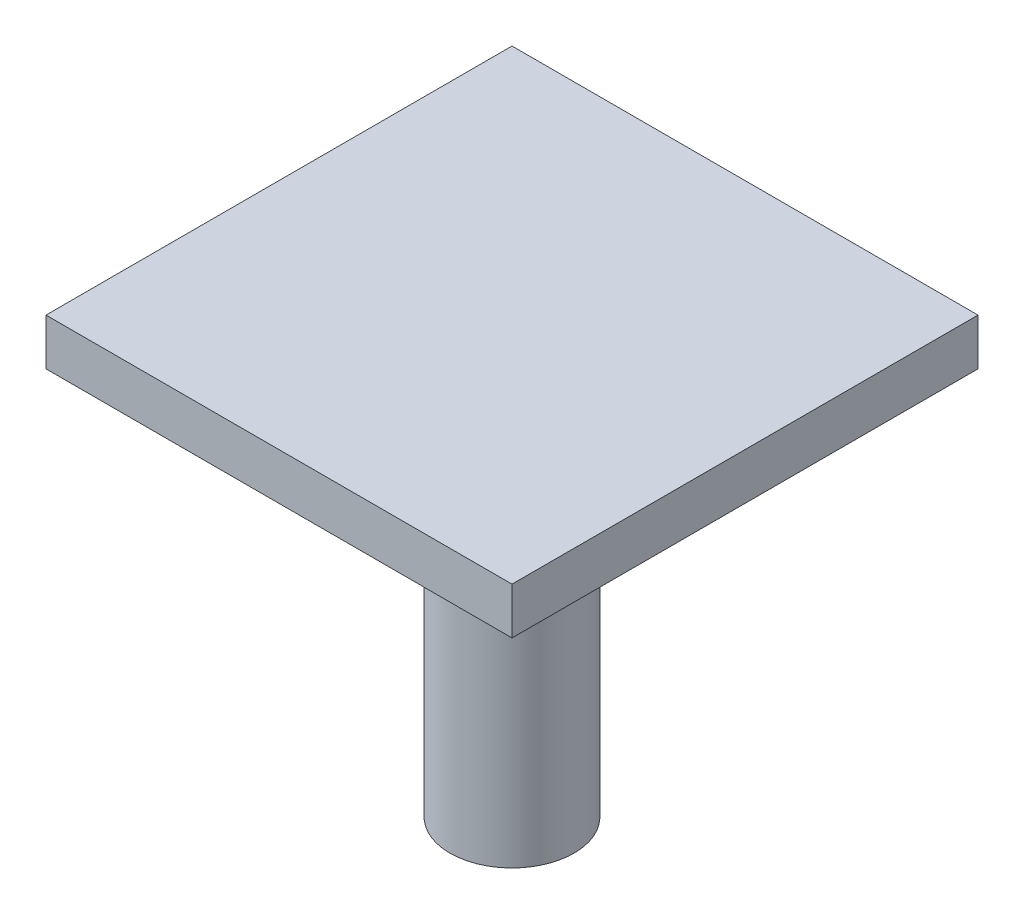
ISO-10303-21;
HEADER;
FILE_DESCRIPTION(('STEP AP214'),'2;1');
FILE_NAME('part.step','',(''),(''),'','','');
FILE_SCHEMA(('AUTOMOTIVE_DESIGN { 1 0 10303 214 1 1 1 1 }'));
ENDSEC;
DATA;
#1=APPLICATION_CONTEXT('core data for automotive mechanical design processes');
#2=APPLICATION_PROTOCOL_DEFINITION('international standard','automotive_design',2000,#1);
#3=PRODUCT_CONTEXT('',#1,'mechanical');
#4=PRODUCT('Part','Part','',(#3));
#5=PRODUCT_RELATED_PRODUCT_CATEGORY('part','',(#4));
#6=PRODUCT_DEFINITION_FORMATION('','',#4);
#7=PRODUCT_DEFINITION_CONTEXT('part definition',#1,'design');
#8=PRODUCT_DEFINITION('design','',#6,#7);
#9=PRODUCT_DEFINITION_SHAPE('','',#8);
#10=(LENGTH_UNIT() NAMED_UNIT(*) SI_UNIT(.MILLI.,.METRE.));
#11=(NAMED_UNIT(*) PLANE_ANGLE_UNIT() SI_UNIT($,.RADIAN.));
#12=(NAMED_UNIT(*) SI_UNIT($,.STERADIAN.) SOLID_ANGLE_UNIT());
#13=UNCERTAINTY_MEASURE_WITH_UNIT(LENGTH_MEASURE(1.E-05),#10,'distance_accuracy_value','');
#14=(GEOMETRIC_REPRESENTATION_CONTEXT(3) GLOBAL_UNCERTAINTY_ASSIGNED_CONTEXT((#13)) GLOBAL_UNIT_ASSIGNED_CONTEXT((#10,
#11,#12)) REPRESENTATION_CONTEXT('',''));
#15=CARTESIAN_POINT('',(0.,0.,0.));
#16=DIRECTION('',(0.,0.,1.));
#17=DIRECTION('',(1.,0.,0.));
#18=AXIS2_PLACEMENT_3D('',#15,#16,#17);
#19=CARTESIAN_POINT('',(17.6016011392974,27.,25.));
#20=DIRECTION('',(0.,-1.,0.));
#21=DIRECTION('',(0.,0.,-1.));
#22=AXIS2_PLACEMENT_3D('',#19,#20,#21);
#23=CYLINDRICAL_SURFACE('',#22,4.);
#24=CARTESIAN_POINT('',(17.6016011392974,27.,25.));
#25=DIRECTION('',(0.,1.,0.));
#26=DIRECTION('',(0.,0.,1.));
#27=AXIS2_PLACEMENT_3D('',#24,#25,#26);
#28=CIRCLE('',#27,4.);
#29=CARTESIAN_POINT('',(17.6016011392974,27.,29.));
#30=VERTEX_POINT('',#29);
#31=EDGE_CURVE('E11',#30,#30,#28,.T.);
#32=ORIENTED_EDGE('',*,*,#31,.F.);
#33=EDGE_LOOP('',(#32));
#34=FACE_BOUND('',#33,.T.);
#35=CARTESIAN_POINT('',(17.6016011392974,2.,25.));
#36=DIRECTION('',(0.,1.,0.));
#37=DIRECTION('',(0.,0.,1.));
#38=AXIS2_PLACEMENT_3D('',#35,#36,#37);
#39=CIRCLE('',#38,4.);
#40=CARTESIAN_POINT('',(17.6016011392974,2.,29.));
#41=VERTEX_POINT('',#40);
#42=EDGE_CURVE('E43',#41,#41,#39,.T.);
#43=ORIENTED_EDGE('',*,*,#42,.T.);
#44=EDGE_LOOP('',(#43));
#45=FACE_BOUND('',#44,.T.);
#46=ADVANCED_FACE('F40',(#34,#45),#23,.T.);
#47=CARTESIAN_POINT('',(0.,2.,0.));
#48=DIRECTION('',(0.,1.,0.));
#49=DIRECTION('',(0.,0.,1.));
#50=AXIS2_PLACEMENT_3D('',#47,#48,#49);
#51=PLANE('',#50);
#52=ORIENTED_EDGE('',*,*,#42,.F.);
#53=EDGE_LOOP('',(#52));
#54=FACE_BOUND('',#53,.T.);
#55=ADVANCED_FACE('F119',(#54),#51,.F.);
#56=CARTESIAN_POINT('',(2.60160113929744,30.,9.99999999999998));
#57=DIRECTION('',(1.,0.,0.));
#58=DIRECTION('',(0.,0.,-1.));
#59=AXIS2_PLACEMENT_3D('',#56,#57,#58);
#60=PLANE('',#59);
#61=DIRECTION('',(0.,0.,1.));
#62=VECTOR('',#61,1.);
#63=CARTESIAN_POINT('',(2.60160113929744,27.,9.99999999999998));
#64=LINE('',#63,#62);
#65=CARTESIAN_POINT('',(2.60160113929744,27.,9.99999999999998));
#66=VERTEX_POINT('',#65);
#67=CARTESIAN_POINT('',(2.60160113929744,27.,40.));
#68=VERTEX_POINT('',#67);
#69=EDGE_CURVE('E107',#66,#68,#64,.T.);
#70=ORIENTED_EDGE('',*,*,#69,.T.);
#71=DIRECTION('',(0.,-1.,0.));
#72=VECTOR('',#71,1.);
#73=CARTESIAN_POINT('',(2.60160113929744,30.,40.));
#74=LINE('',#73,#72);
#75=CARTESIAN_POINT('',(2.60160113929744,30.,40.));
#76=VERTEX_POINT('',#75);
#77=EDGE_CURVE('E98',#76,#68,#74,.T.);
#78=ORIENTED_EDGE('',*,*,#77,.F.);
#79=DIRECTION('',(0.,0.,1.));
#80=VECTOR('',#79,1.);
#81=CARTESIAN_POINT('',(2.60160113929744,30.,9.99999999999998));
#82=LINE('',#81,#80);
#83=CARTESIAN_POINT('',(2.60160113929744,30.,9.99999999999998));
#84=VERTEX_POINT('',#83);
#85=EDGE_CURVE('E92',#84,#76,#82,.T.);
#86=ORIENTED_EDGE('',*,*,#85,.F.);
#87=DIRECTION('',(0.,-1.,0.));
#88=VECTOR('',#87,1.);
#89=CARTESIAN_POINT('',(2.60160113929744,30.,9.99999999999998));
#90=LINE('',#89,#88);
#91=EDGE_CURVE('E103',#84,#66,#90,.T.);
#92=ORIENTED_EDGE('',*,*,#91,.T.);
#93=EDGE_LOOP('',(#70,#78,#86,#92));
#94=FACE_BOUND('',#93,.T.);
#95=ADVANCED_FACE('F121',(#94),#60,.F.);
#96=CARTESIAN_POINT('',(2.60160113929744,30.,40.));
#97=DIRECTION('',(0.,0.,-1.));
#98=DIRECTION('',(-1.,0.,0.));
#99=AXIS2_PLACEMENT_3D('',#96,#97,#98);
#100=PLANE('',#99);
#101=DIRECTION('',(1.,0.,0.));
#102=VECTOR('',#101,1.);
#103=CARTESIAN_POINT('',(2.60160113929744,27.,40.));
#104=LINE('',#103,#102);
#105=CARTESIAN_POINT('',(32.6016011392974,27.,40.));
#106=VERTEX_POINT('',#105);
#107=EDGE_CURVE('E97',#68,#106,#104,.T.);
#108=ORIENTED_EDGE('',*,*,#107,.T.);
#109=DIRECTION('',(0.,-1.,0.));
#110=VECTOR('',#109,1.);
#111=CARTESIAN_POINT('',(32.6016011392974,30.,40.));
#112=LINE('',#111,#110);
#113=CARTESIAN_POINT('',(32.6016011392974,30.,40.));
#114=VERTEX_POINT('',#113);
#115=EDGE_CURVE('E95',#114,#106,#112,.T.);
#116=ORIENTED_EDGE('',*,*,#115,.F.);
#117=DIRECTION('',(1.,0.,0.));
#118=VECTOR('',#117,1.);
#119=CARTESIAN_POINT('',(2.60160113929744,30.,40.));
#120=LINE('',#119,#118);
#121=EDGE_CURVE('E87',#76,#114,#120,.T.);
#122=ORIENTED_EDGE('',*,*,#121,.F.);
#123=ORIENTED_EDGE('',*,*,#77,.T.);
#124=EDGE_LOOP('',(#108,#116,#122,#123));
#125=FACE_BOUND('',#124,.T.);
#126=ADVANCED_FACE('F96',(#125),#100,.F.);
#127=CARTESIAN_POINT('',(32.6016011392974,30.,9.99999999999998));
#128=DIRECTION('',(-1.,0.,0.));
#129=DIRECTION('',(0.,0.,1.));
#130=AXIS2_PLACEMENT_3D('',#127,#128,#129);
#131=PLANE('',#130);
#132=DIRECTION('',(0.,0.,-1.));
#133=VECTOR('',#132,1.);
#134=CARTESIAN_POINT('',(32.6016011392974,27.,9.99999999999998));
#135=LINE('',#134,#133);
#136=CARTESIAN_POINT('',(32.6016011392974,27.,9.99999999999998));
#137=VERTEX_POINT('',#136);
#138=EDGE_CURVE('E73',#106,#137,#135,.T.);
#139=ORIENTED_EDGE('',*,*,#138,.T.);
#140=DIRECTION('',(0.,-1.,0.));
#141=VECTOR('',#140,1.);
#142=CARTESIAN_POINT('',(32.6016011392974,30.,9.99999999999998));
#143=LINE('',#142,#141);
#144=CARTESIAN_POINT('',(32.6016011392974,30.,9.99999999999998));
#145=VERTEX_POINT('',#144);
#146=EDGE_CURVE('E99',#145,#137,#143,.T.);
#147=ORIENTED_EDGE('',*,*,#146,.F.);
#148=DIRECTION('',(0.,0.,-1.));
#149=VECTOR('',#148,1.);
#150=CARTESIAN_POINT('',(32.6016011392974,30.,9.99999999999998));
#151=LINE('',#150,#149);
#152=EDGE_CURVE('E90',#114,#145,#151,.T.);
#153=ORIENTED_EDGE('',*,*,#152,.F.);
#154=ORIENTED_EDGE('',*,*,#115,.T.);
#155=EDGE_LOOP('',(#139,#147,#153,#154));
#156=FACE_BOUND('',#155,.T.);
#157=ADVANCED_FACE('F101',(#156),#131,.F.);
#158=CARTESIAN_POINT('',(2.60160113929744,30.,9.99999999999998));
#159=DIRECTION('',(0.,0.,1.));
#160=DIRECTION('',(1.,0.,0.));
#161=AXIS2_PLACEMENT_3D('',#158,#159,#160);
#162=PLANE('',#161);
#163=DIRECTION('',(-1.,0.,0.));
#164=VECTOR('',#163,1.);
#165=CARTESIAN_POINT('',(2.60160113929744,27.,9.99999999999998));
#166=LINE('',#165,#164);
#167=EDGE_CURVE('E79',#137,#66,#166,.T.);
#168=ORIENTED_EDGE('',*,*,#167,.T.);
#169=ORIENTED_EDGE('',*,*,#91,.F.);
#170=DIRECTION('',(-1.,0.,0.));
#171=VECTOR('',#170,1.);
#172=CARTESIAN_POINT('',(2.60160113929744,30.,9.99999999999998));
#173=LINE('',#172,#171);
#174=EDGE_CURVE('E56',#145,#84,#173,.T.);
#175=ORIENTED_EDGE('',*,*,#174,.F.);
#176=ORIENTED_EDGE('',*,*,#146,.T.);
#177=EDGE_LOOP('',(#168,#169,#175,#176));
#178=FACE_BOUND('',#177,.T.);
#179=ADVANCED_FACE('F134',(#178),#162,.F.);
#180=CARTESIAN_POINT('',(0.,30.,0.));
#181=DIRECTION('',(0.,1.,0.));
#182=DIRECTION('',(0.,0.,1.));
#183=AXIS2_PLACEMENT_3D('',#180,#181,#182);
#184=PLANE('',#183);
#185=ORIENTED_EDGE('',*,*,#85,.T.);
#186=ORIENTED_EDGE('',*,*,#121,.T.);
#187=ORIENTED_EDGE('',*,*,#152,.T.);
#188=ORIENTED_EDGE('',*,*,#174,.T.);
#189=EDGE_LOOP('',(#185,#186,#187,#188));
#190=FACE_BOUND('',#189,.T.);
#191=ADVANCED_FACE('F88',(#190),#184,.T.);
#192=CARTESIAN_POINT('',(0.,27.,0.));
#193=DIRECTION('',(0.,1.,0.));
#194=DIRECTION('',(0.,0.,1.));
#195=AXIS2_PLACEMENT_3D('',#192,#193,#194);
#196=PLANE('',#195);
#197=ORIENTED_EDGE('',*,*,#31,.T.);
#198=EDGE_LOOP('',(#197));
#199=FACE_BOUND('',#198,.T.);
#200=ORIENTED_EDGE('',*,*,#69,.F.);
#201=ORIENTED_EDGE('',*,*,#167,.F.);
#202=ORIENTED_EDGE('',*,*,#138,.F.);
#203=ORIENTED_EDGE('',*,*,#107,.F.);
#204=EDGE_LOOP('',(#200,#201,#202,#203));
#205=FACE_BOUND('',#204,.T.);
#206=ADVANCED_FACE('F137',(#199,#205),#196,.F.);
#207=CLOSED_SHELL('',(#46,#55,#95,#126,#157,#179,#191,#206));
#208=MANIFOLD_SOLID_BREP('B2',#207);
#209=ADVANCED_BREP_SHAPE_REPRESENTATION('',(#18,#208),#14);
#210=SHAPE_DEFINITION_REPRESENTATION(#9,#209);
ENDSEC;
END-ISO-10303-21;
